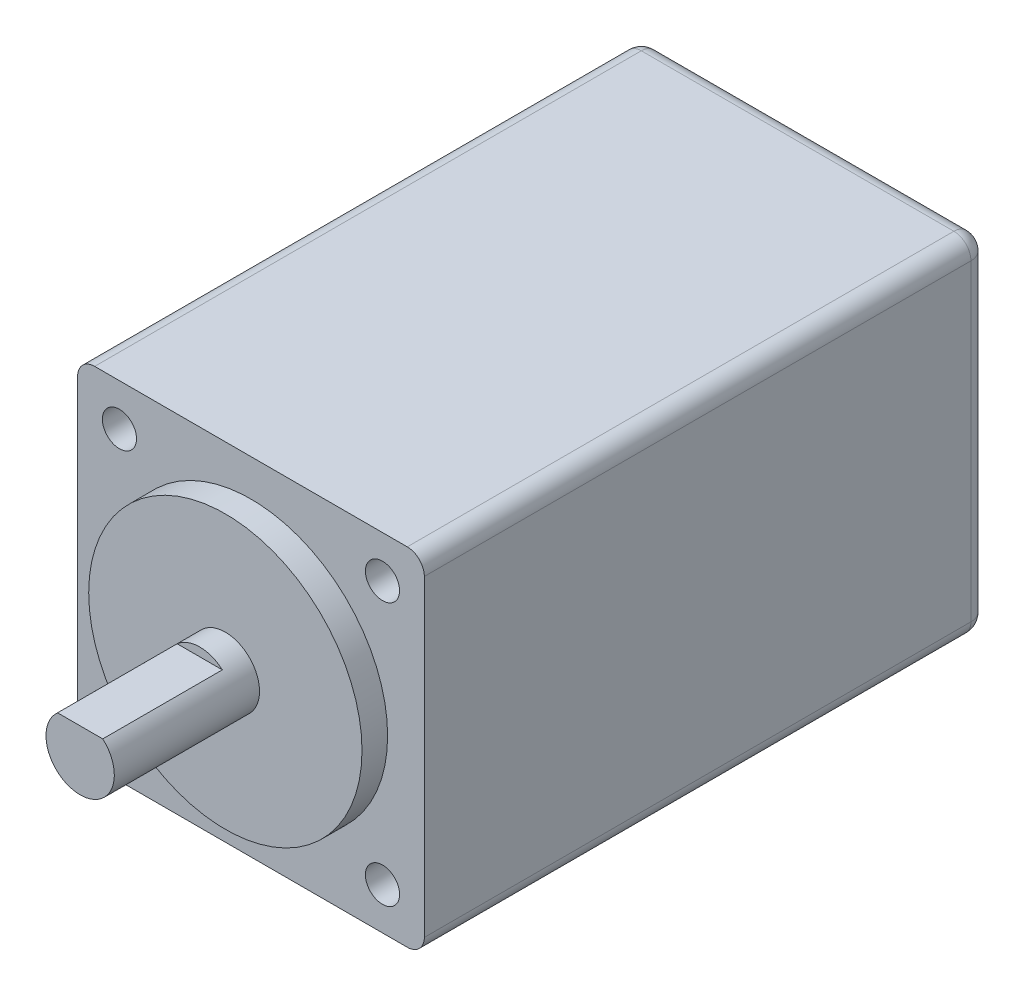
ISO-10303-21;
HEADER;
FILE_DESCRIPTION(('STEP AP214'),'2;1');
FILE_NAME('part.step','',(''),(''),'','','');
FILE_SCHEMA(('AUTOMOTIVE_DESIGN { 1 0 10303 214 1 1 1 1 }'));
ENDSEC;
DATA;
#1=APPLICATION_CONTEXT('core data for automotive mechanical design processes');
#2=APPLICATION_PROTOCOL_DEFINITION('international standard','automotive_design',2000,#1);
#3=PRODUCT_CONTEXT('',#1,'mechanical');
#4=PRODUCT('Part','Part','',(#3));
#5=PRODUCT_RELATED_PRODUCT_CATEGORY('part','',(#4));
#6=PRODUCT_DEFINITION_FORMATION('','',#4);
#7=PRODUCT_DEFINITION_CONTEXT('part definition',#1,'design');
#8=PRODUCT_DEFINITION('design','',#6,#7);
#9=PRODUCT_DEFINITION_SHAPE('','',#8);
#10=(LENGTH_UNIT() NAMED_UNIT(*) SI_UNIT(.MILLI.,.METRE.));
#11=(NAMED_UNIT(*) PLANE_ANGLE_UNIT() SI_UNIT($,.RADIAN.));
#12=(NAMED_UNIT(*) SI_UNIT($,.STERADIAN.) SOLID_ANGLE_UNIT());
#13=UNCERTAINTY_MEASURE_WITH_UNIT(LENGTH_MEASURE(1.E-05),#10,'distance_accuracy_value','');
#14=(GEOMETRIC_REPRESENTATION_CONTEXT(3) GLOBAL_UNCERTAINTY_ASSIGNED_CONTEXT((#13)) GLOBAL_UNIT_ASSIGNED_CONTEXT((#10,
#11,#12)) REPRESENTATION_CONTEXT('',''));
#15=CARTESIAN_POINT('',(0.,0.,0.));
#16=DIRECTION('',(0.,0.,1.));
#17=DIRECTION('',(1.,0.,0.));
#18=AXIS2_PLACEMENT_3D('',#15,#16,#17);
#19=CARTESIAN_POINT('',(0.,0.,34.5));
#20=DIRECTION('',(0.,0.,1.));
#21=DIRECTION('',(1.,0.,0.));
#22=AXIS2_PLACEMENT_3D('',#19,#20,#21);
#23=PLANE('',#22);
#24=CARTESIAN_POINT('',(0.,0.,34.5));
#25=DIRECTION('',(0.,0.,1.));
#26=DIRECTION('',(1.,0.,0.));
#27=AXIS2_PLACEMENT_3D('',#24,#25,#26);
#28=CIRCLE('',#27,8.);
#29=CARTESIAN_POINT('',(8.,0.,34.5));
#30=VERTEX_POINT('',#29);
#31=EDGE_CURVE('E144',#30,#30,#28,.T.);
#32=ORIENTED_EDGE('',*,*,#31,.T.);
#33=EDGE_LOOP('',(#32));
#34=FACE_BOUND('',#33,.T.);
#35=CARTESIAN_POINT('',(0.,0.,34.5));
#36=DIRECTION('',(0.,0.,1.));
#37=DIRECTION('',(1.,0.,0.));
#38=AXIS2_PLACEMENT_3D('',#35,#36,#37);
#39=CIRCLE('',#38,2.);
#40=CARTESIAN_POINT('',(2.,0.,34.5));
#41=VERTEX_POINT('',#40);
#42=EDGE_CURVE('E145',#41,#41,#39,.T.);
#43=ORIENTED_EDGE('',*,*,#42,.F.);
#44=EDGE_LOOP('',(#43));
#45=FACE_BOUND('',#44,.T.);
#46=ADVANCED_FACE('F33',(#34,#45),#23,.T.);
#47=CARTESIAN_POINT('',(10.15,10.15,33.));
#48=DIRECTION('',(0.,0.,-1.));
#49=DIRECTION('',(-1.,0.,0.));
#50=AXIS2_PLACEMENT_3D('',#47,#48,#49);
#51=PLANE('',#50);
#52=CARTESIAN_POINT('',(-7.69999999999969,-7.7,33.));
#53=DIRECTION('',(0.,0.,1.));
#54=DIRECTION('',(1.,0.,0.));
#55=AXIS2_PLACEMENT_3D('',#52,#53,#54);
#56=CIRCLE('',#55,1.);
#57=CARTESIAN_POINT('',(-6.69999999999969,-7.7,33.));
#58=VERTEX_POINT('',#57);
#59=EDGE_CURVE('E237',#58,#58,#56,.T.);
#60=ORIENTED_EDGE('',*,*,#59,.F.);
#61=EDGE_LOOP('',(#60));
#62=FACE_BOUND('',#61,.T.);
#63=CARTESIAN_POINT('',(7.70000000000031,-7.69999999999969,33.));
#64=DIRECTION('',(0.,0.,1.));
#65=DIRECTION('',(1.,0.,0.));
#66=AXIS2_PLACEMENT_3D('',#63,#64,#65);
#67=CIRCLE('',#66,1.);
#68=CARTESIAN_POINT('',(8.70000000000032,-7.69999999999969,33.));
#69=VERTEX_POINT('',#68);
#70=EDGE_CURVE('E245',#69,#69,#67,.T.);
#71=ORIENTED_EDGE('',*,*,#70,.F.);
#72=EDGE_LOOP('',(#71));
#73=FACE_BOUND('',#72,.T.);
#74=CARTESIAN_POINT('',(7.7,7.70000000000031,33.));
#75=DIRECTION('',(0.,0.,1.));
#76=DIRECTION('',(1.,0.,0.));
#77=AXIS2_PLACEMENT_3D('',#74,#75,#76);
#78=CIRCLE('',#77,1.);
#79=CARTESIAN_POINT('',(8.7,7.70000000000031,33.));
#80=VERTEX_POINT('',#79);
#81=EDGE_CURVE('E251',#80,#80,#78,.T.);
#82=ORIENTED_EDGE('',*,*,#81,.F.);
#83=EDGE_LOOP('',(#82));
#84=FACE_BOUND('',#83,.T.);
#85=CARTESIAN_POINT('',(-7.7,7.7,33.));
#86=DIRECTION('',(0.,0.,1.));
#87=DIRECTION('',(1.,0.,0.));
#88=AXIS2_PLACEMENT_3D('',#85,#86,#87);
#89=CIRCLE('',#88,1.);
#90=CARTESIAN_POINT('',(-6.7,7.7,33.));
#91=VERTEX_POINT('',#90);
#92=EDGE_CURVE('E257',#91,#91,#89,.T.);
#93=ORIENTED_EDGE('',*,*,#92,.F.);
#94=EDGE_LOOP('',(#93));
#95=FACE_BOUND('',#94,.T.);
#96=DIRECTION('',(0.,-1.,0.));
#97=VECTOR('',#96,1.);
#98=CARTESIAN_POINT('',(-10.15,-10.15,33.));
#99=LINE('',#98,#97);
#100=CARTESIAN_POINT('',(-10.15,9.15,33.));
#101=VERTEX_POINT('',#100);
#102=CARTESIAN_POINT('',(-10.15,-9.15,33.));
#103=VERTEX_POINT('',#102);
#104=EDGE_CURVE('E159',#101,#103,#99,.T.);
#105=ORIENTED_EDGE('',*,*,#104,.T.);
#106=CARTESIAN_POINT('',(-9.15,-9.15,33.));
#107=DIRECTION('',(0.,0.,-1.));
#108=DIRECTION('',(-1.,0.,0.));
#109=AXIS2_PLACEMENT_3D('',#106,#107,#108);
#110=CIRCLE('',#109,1.);
#111=CARTESIAN_POINT('',(-9.15,-10.15,33.));
#112=VERTEX_POINT('',#111);
#113=EDGE_CURVE('E11',#103,#112,#110,.F.);
#114=ORIENTED_EDGE('',*,*,#113,.T.);
#115=DIRECTION('',(1.,0.,0.));
#116=VECTOR('',#115,1.);
#117=CARTESIAN_POINT('',(-10.15,-10.15,33.));
#118=LINE('',#117,#116);
#119=CARTESIAN_POINT('',(9.15,-10.15,33.));
#120=VERTEX_POINT('',#119);
#121=EDGE_CURVE('E162',#112,#120,#118,.T.);
#122=ORIENTED_EDGE('',*,*,#121,.T.);
#123=CARTESIAN_POINT('',(9.15,-9.15,33.));
#124=DIRECTION('',(0.,0.,-1.));
#125=DIRECTION('',(-1.,0.,0.));
#126=AXIS2_PLACEMENT_3D('',#123,#124,#125);
#127=CIRCLE('',#126,1.);
#128=CARTESIAN_POINT('',(10.15,-9.15,33.));
#129=VERTEX_POINT('',#128);
#130=EDGE_CURVE('E42',#120,#129,#127,.F.);
#131=ORIENTED_EDGE('',*,*,#130,.T.);
#132=DIRECTION('',(0.,1.,0.));
#133=VECTOR('',#132,1.);
#134=CARTESIAN_POINT('',(10.15,-10.15,33.));
#135=LINE('',#134,#133);
#136=CARTESIAN_POINT('',(10.15,9.15,33.));
#137=VERTEX_POINT('',#136);
#138=EDGE_CURVE('E148',#129,#137,#135,.T.);
#139=ORIENTED_EDGE('',*,*,#138,.T.);
#140=CARTESIAN_POINT('',(9.15,9.15,33.));
#141=DIRECTION('',(0.,0.,-1.));
#142=DIRECTION('',(-1.,0.,0.));
#143=AXIS2_PLACEMENT_3D('',#140,#141,#142);
#144=CIRCLE('',#143,1.);
#145=CARTESIAN_POINT('',(9.15,10.15,33.));
#146=VERTEX_POINT('',#145);
#147=EDGE_CURVE('E200',#137,#146,#144,.F.);
#148=ORIENTED_EDGE('',*,*,#147,.T.);
#149=DIRECTION('',(-1.,0.,0.));
#150=VECTOR('',#149,1.);
#151=CARTESIAN_POINT('',(-10.15,10.15,33.));
#152=LINE('',#151,#150);
#153=CARTESIAN_POINT('',(-9.15,10.15,33.));
#154=VERTEX_POINT('',#153);
#155=EDGE_CURVE('E156',#146,#154,#152,.T.);
#156=ORIENTED_EDGE('',*,*,#155,.T.);
#157=CARTESIAN_POINT('',(-9.15,9.15,33.));
#158=DIRECTION('',(0.,0.,-1.));
#159=DIRECTION('',(-1.,0.,0.));
#160=AXIS2_PLACEMENT_3D('',#157,#158,#159);
#161=CIRCLE('',#160,1.);
#162=EDGE_CURVE('E202',#154,#101,#161,.F.);
#163=ORIENTED_EDGE('',*,*,#162,.T.);
#164=EDGE_LOOP('',(#105,#114,#122,#131,#139,#148,#156,#163));
#165=FACE_BOUND('',#164,.T.);
#166=CARTESIAN_POINT('',(0.,0.,33.));
#167=DIRECTION('',(0.,0.,-1.));
#168=DIRECTION('',(-1.,0.,0.));
#169=AXIS2_PLACEMENT_3D('',#166,#167,#168);
#170=CIRCLE('',#169,8.);
#171=CARTESIAN_POINT('',(-8.,0.,33.));
#172=VERTEX_POINT('',#171);
#173=EDGE_CURVE('E134',#172,#172,#170,.F.);
#174=ORIENTED_EDGE('',*,*,#173,.F.);
#175=EDGE_LOOP('',(#174));
#176=FACE_BOUND('',#175,.T.);
#177=ADVANCED_FACE('F278',(#62,#73,#84,#95,#165,#176),#51,.F.);
#178=CARTESIAN_POINT('',(10.15,-10.15,33.));
#179=DIRECTION('',(-1.,0.,0.));
#180=DIRECTION('',(0.,0.,1.));
#181=AXIS2_PLACEMENT_3D('',#178,#179,#180);
#182=PLANE('',#181);
#183=ORIENTED_EDGE('',*,*,#138,.F.);
#184=DIRECTION('',(0.,0.,-1.));
#185=VECTOR('',#184,1.);
#186=CARTESIAN_POINT('',(10.15,-9.15,33.));
#187=LINE('',#186,#185);
#188=CARTESIAN_POINT('',(10.15,-9.15,1.));
#189=VERTEX_POINT('',#188);
#190=EDGE_CURVE('E50',#129,#189,#187,.T.);
#191=ORIENTED_EDGE('',*,*,#190,.T.);
#192=DIRECTION('',(0.,1.,0.));
#193=VECTOR('',#192,1.);
#194=CARTESIAN_POINT('',(10.15,10.15,1.));
#195=LINE('',#194,#193);
#196=CARTESIAN_POINT('',(10.15,9.15,1.));
#197=VERTEX_POINT('',#196);
#198=EDGE_CURVE('E55',#189,#197,#195,.T.);
#199=ORIENTED_EDGE('',*,*,#198,.T.);
#200=DIRECTION('',(0.,0.,-1.));
#201=VECTOR('',#200,1.);
#202=CARTESIAN_POINT('',(10.15,9.15,33.));
#203=LINE('',#202,#201);
#204=EDGE_CURVE('E196',#197,#137,#203,.F.);
#205=ORIENTED_EDGE('',*,*,#204,.T.);
#206=EDGE_LOOP('',(#183,#191,#199,#205));
#207=FACE_BOUND('',#206,.T.);
#208=ADVANCED_FACE('F284',(#207),#182,.F.);
#209=CARTESIAN_POINT('',(-10.15,10.15,33.));
#210=DIRECTION('',(0.,-1.,0.));
#211=DIRECTION('',(0.,0.,-1.));
#212=AXIS2_PLACEMENT_3D('',#209,#210,#211);
#213=PLANE('',#212);
#214=DIRECTION('',(-1.,0.,0.));
#215=VECTOR('',#214,1.);
#216=CARTESIAN_POINT('',(-10.15,10.15,1.));
#217=LINE('',#216,#215);
#218=CARTESIAN_POINT('',(9.15,10.15,1.));
#219=VERTEX_POINT('',#218);
#220=CARTESIAN_POINT('',(-9.15,10.15,1.));
#221=VERTEX_POINT('',#220);
#222=EDGE_CURVE('E170',#219,#221,#217,.T.);
#223=ORIENTED_EDGE('',*,*,#222,.T.);
#224=DIRECTION('',(0.,0.,-1.));
#225=VECTOR('',#224,1.);
#226=CARTESIAN_POINT('',(-9.15,10.15,33.));
#227=LINE('',#226,#225);
#228=EDGE_CURVE('E173',#221,#154,#227,.F.);
#229=ORIENTED_EDGE('',*,*,#228,.T.);
#230=ORIENTED_EDGE('',*,*,#155,.F.);
#231=DIRECTION('',(0.,0.,-1.));
#232=VECTOR('',#231,1.);
#233=CARTESIAN_POINT('',(9.15,10.15,33.));
#234=LINE('',#233,#232);
#235=EDGE_CURVE('E168',#146,#219,#234,.T.);
#236=ORIENTED_EDGE('',*,*,#235,.T.);
#237=EDGE_LOOP('',(#223,#229,#230,#236));
#238=FACE_BOUND('',#237,.T.);
#239=ADVANCED_FACE('F305',(#238),#213,.F.);
#240=CARTESIAN_POINT('',(-10.15,-10.15,33.));
#241=DIRECTION('',(1.,0.,0.));
#242=DIRECTION('',(0.,0.,-1.));
#243=AXIS2_PLACEMENT_3D('',#240,#241,#242);
#244=PLANE('',#243);
#245=DIRECTION('',(0.,-1.,0.));
#246=VECTOR('',#245,1.);
#247=CARTESIAN_POINT('',(-10.15,-10.15,1.));
#248=LINE('',#247,#246);
#249=CARTESIAN_POINT('',(-10.15,9.15,1.));
#250=VERTEX_POINT('',#249);
#251=CARTESIAN_POINT('',(-10.15,-9.15,1.));
#252=VERTEX_POINT('',#251);
#253=EDGE_CURVE('E186',#250,#252,#248,.T.);
#254=ORIENTED_EDGE('',*,*,#253,.T.);
#255=DIRECTION('',(0.,0.,-1.));
#256=VECTOR('',#255,1.);
#257=CARTESIAN_POINT('',(-10.15,-9.15,33.));
#258=LINE('',#257,#256);
#259=EDGE_CURVE('E188',#252,#103,#258,.F.);
#260=ORIENTED_EDGE('',*,*,#259,.T.);
#261=ORIENTED_EDGE('',*,*,#104,.F.);
#262=DIRECTION('',(0.,0.,-1.));
#263=VECTOR('',#262,1.);
#264=CARTESIAN_POINT('',(-10.15,9.15,33.));
#265=LINE('',#264,#263);
#266=EDGE_CURVE('E184',#101,#250,#265,.T.);
#267=ORIENTED_EDGE('',*,*,#266,.T.);
#268=EDGE_LOOP('',(#254,#260,#261,#267));
#269=FACE_BOUND('',#268,.T.);
#270=ADVANCED_FACE('F301',(#269),#244,.F.);
#271=CARTESIAN_POINT('',(-10.15,-10.15,33.));
#272=DIRECTION('',(0.,1.,0.));
#273=DIRECTION('',(0.,0.,1.));
#274=AXIS2_PLACEMENT_3D('',#271,#272,#273);
#275=PLANE('',#274);
#276=ORIENTED_EDGE('',*,*,#121,.F.);
#277=DIRECTION('',(0.,0.,-1.));
#278=VECTOR('',#277,1.);
#279=CARTESIAN_POINT('',(-9.15,-10.15,33.));
#280=LINE('',#279,#278);
#281=CARTESIAN_POINT('',(-9.15,-10.15,1.));
#282=VERTEX_POINT('',#281);
#283=EDGE_CURVE('E194',#112,#282,#280,.T.);
#284=ORIENTED_EDGE('',*,*,#283,.T.);
#285=DIRECTION('',(1.,0.,0.));
#286=VECTOR('',#285,1.);
#287=CARTESIAN_POINT('',(10.15,-10.15,1.));
#288=LINE('',#287,#286);
#289=CARTESIAN_POINT('',(9.15,-10.15,1.));
#290=VERTEX_POINT('',#289);
#291=EDGE_CURVE('E192',#282,#290,#288,.T.);
#292=ORIENTED_EDGE('',*,*,#291,.T.);
#293=DIRECTION('',(0.,0.,-1.));
#294=VECTOR('',#293,1.);
#295=CARTESIAN_POINT('',(9.15,-10.15,33.));
#296=LINE('',#295,#294);
#297=EDGE_CURVE('E190',#290,#120,#296,.F.);
#298=ORIENTED_EDGE('',*,*,#297,.T.);
#299=EDGE_LOOP('',(#276,#284,#292,#298));
#300=FACE_BOUND('',#299,.T.);
#301=ADVANCED_FACE('F297',(#300),#275,.F.);
#302=CARTESIAN_POINT('',(10.15,10.15,0.));
#303=DIRECTION('',(0.,0.,-1.));
#304=DIRECTION('',(-1.,0.,0.));
#305=AXIS2_PLACEMENT_3D('',#302,#303,#304);
#306=PLANE('',#305);
#307=DIRECTION('',(0.,-1.,0.));
#308=VECTOR('',#307,1.);
#309=CARTESIAN_POINT('',(-9.15,10.15,0.));
#310=LINE('',#309,#308);
#311=CARTESIAN_POINT('',(-9.15,-9.15,0.));
#312=VERTEX_POINT('',#311);
#313=CARTESIAN_POINT('',(-9.15,9.15,0.));
#314=VERTEX_POINT('',#313);
#315=EDGE_CURVE('E179',#312,#314,#310,.F.);
#316=ORIENTED_EDGE('',*,*,#315,.T.);
#317=DIRECTION('',(-1.,0.,0.));
#318=VECTOR('',#317,1.);
#319=CARTESIAN_POINT('',(10.15,9.15,0.));
#320=LINE('',#319,#318);
#321=CARTESIAN_POINT('',(9.15,9.15,0.));
#322=VERTEX_POINT('',#321);
#323=EDGE_CURVE('E181',#314,#322,#320,.F.);
#324=ORIENTED_EDGE('',*,*,#323,.T.);
#325=DIRECTION('',(0.,1.,0.));
#326=VECTOR('',#325,1.);
#327=CARTESIAN_POINT('',(9.15,-10.15,0.));
#328=LINE('',#327,#326);
#329=CARTESIAN_POINT('',(9.15,-9.15,0.));
#330=VERTEX_POINT('',#329);
#331=EDGE_CURVE('E175',#322,#330,#328,.F.);
#332=ORIENTED_EDGE('',*,*,#331,.T.);
#333=DIRECTION('',(1.,0.,0.));
#334=VECTOR('',#333,1.);
#335=CARTESIAN_POINT('',(-10.15,-9.15,0.));
#336=LINE('',#335,#334);
#337=EDGE_CURVE('E177',#330,#312,#336,.F.);
#338=ORIENTED_EDGE('',*,*,#337,.T.);
#339=EDGE_LOOP('',(#316,#324,#332,#338));
#340=FACE_BOUND('',#339,.T.);
#341=ADVANCED_FACE('F292',(#340),#306,.T.);
#342=CARTESIAN_POINT('',(0.,0.,34.5));
#343=DIRECTION('',(0.,0.,-1.));
#344=DIRECTION('',(-1.,0.,0.));
#345=AXIS2_PLACEMENT_3D('',#342,#343,#344);
#346=CYLINDRICAL_SURFACE('',#345,8.);
#347=ORIENTED_EDGE('',*,*,#31,.F.);
#348=EDGE_LOOP('',(#347));
#349=FACE_BOUND('',#348,.T.);
#350=ORIENTED_EDGE('',*,*,#173,.T.);
#351=EDGE_LOOP('',(#350));
#352=FACE_BOUND('',#351,.T.);
#353=ADVANCED_FACE('F290',(#349,#352),#346,.T.);
#354=CARTESIAN_POINT('',(0.,0.,43.));
#355=DIRECTION('',(0.,0.,-1.));
#356=DIRECTION('',(-1.,0.,0.));
#357=AXIS2_PLACEMENT_3D('',#354,#355,#356);
#358=CYLINDRICAL_SURFACE('',#357,2.);
#359=CARTESIAN_POINT('',(0.,0.,43.));
#360=DIRECTION('',(0.,0.,1.));
#361=DIRECTION('',(1.,0.,0.));
#362=AXIS2_PLACEMENT_3D('',#359,#360,#361);
#363=CIRCLE('',#362,2.);
#364=CARTESIAN_POINT('',(-1.3228756555323,1.5,43.));
#365=VERTEX_POINT('',#364);
#366=CARTESIAN_POINT('',(1.3228756555323,1.5,43.));
#367=VERTEX_POINT('',#366);
#368=EDGE_CURVE('E140',#365,#367,#363,.T.);
#369=ORIENTED_EDGE('',*,*,#368,.F.);
#370=DIRECTION('',(0.,0.,-1.));
#371=VECTOR('',#370,1.);
#372=CARTESIAN_POINT('',(-1.3228756555323,1.5,43.));
#373=LINE('',#372,#371);
#374=CARTESIAN_POINT('',(-1.3228756555323,1.5,36.));
#375=VERTEX_POINT('',#374);
#376=EDGE_CURVE('E129',#365,#375,#373,.T.);
#377=ORIENTED_EDGE('',*,*,#376,.T.);
#378=CARTESIAN_POINT('',(0.,0.,36.));
#379=DIRECTION('',(0.,0.,-1.));
#380=DIRECTION('',(-1.,0.,0.));
#381=AXIS2_PLACEMENT_3D('',#378,#379,#380);
#382=CIRCLE('',#381,2.);
#383=CARTESIAN_POINT('',(1.3228756555323,1.5,36.));
#384=VERTEX_POINT('',#383);
#385=EDGE_CURVE('E133',#375,#384,#382,.T.);
#386=ORIENTED_EDGE('',*,*,#385,.T.);
#387=DIRECTION('',(0.,0.,-1.));
#388=VECTOR('',#387,1.);
#389=CARTESIAN_POINT('',(1.3228756555323,1.5,43.));
#390=LINE('',#389,#388);
#391=EDGE_CURVE('E126',#384,#367,#390,.F.);
#392=ORIENTED_EDGE('',*,*,#391,.T.);
#393=EDGE_LOOP('',(#369,#377,#386,#392));
#394=FACE_BOUND('',#393,.T.);
#395=ORIENTED_EDGE('',*,*,#42,.T.);
#396=EDGE_LOOP('',(#395));
#397=FACE_BOUND('',#396,.T.);
#398=ADVANCED_FACE('F138',(#394,#397),#358,.T.);
#399=CARTESIAN_POINT('',(0.,0.,43.));
#400=DIRECTION('',(0.,0.,1.));
#401=DIRECTION('',(1.,0.,0.));
#402=AXIS2_PLACEMENT_3D('',#399,#400,#401);
#403=PLANE('',#402);
#404=DIRECTION('',(1.,0.,0.));
#405=VECTOR('',#404,1.);
#406=CARTESIAN_POINT('',(0.,1.5,43.));
#407=LINE('',#406,#405);
#408=EDGE_CURVE('E122',#365,#367,#407,.T.);
#409=ORIENTED_EDGE('',*,*,#408,.F.);
#410=ORIENTED_EDGE('',*,*,#368,.T.);
#411=EDGE_LOOP('',(#409,#410));
#412=FACE_BOUND('',#411,.T.);
#413=ADVANCED_FACE('F143',(#412),#403,.T.);
#414=CARTESIAN_POINT('',(-5.,2.,36.));
#415=DIRECTION('',(0.,0.,-1.));
#416=DIRECTION('',(-1.,0.,0.));
#417=AXIS2_PLACEMENT_3D('',#414,#415,#416);
#418=PLANE('',#417);
#419=DIRECTION('',(1.,0.,0.));
#420=VECTOR('',#419,1.);
#421=CARTESIAN_POINT('',(-5.,1.5,36.));
#422=LINE('',#421,#420);
#423=EDGE_CURVE('E141',#375,#384,#422,.T.);
#424=ORIENTED_EDGE('',*,*,#423,.T.);
#425=ORIENTED_EDGE('',*,*,#385,.F.);
#426=EDGE_LOOP('',(#424,#425));
#427=FACE_BOUND('',#426,.T.);
#428=ADVANCED_FACE('F266',(#427),#418,.F.);
#429=CARTESIAN_POINT('',(-5.,1.5,43.));
#430=DIRECTION('',(0.,-1.,0.));
#431=DIRECTION('',(0.,0.,-1.));
#432=AXIS2_PLACEMENT_3D('',#429,#430,#431);
#433=PLANE('',#432);
#434=ORIENTED_EDGE('',*,*,#408,.T.);
#435=ORIENTED_EDGE('',*,*,#391,.F.);
#436=ORIENTED_EDGE('',*,*,#423,.F.);
#437=ORIENTED_EDGE('',*,*,#376,.F.);
#438=EDGE_LOOP('',(#434,#435,#436,#437));
#439=FACE_BOUND('',#438,.T.);
#440=ADVANCED_FACE('F124',(#439),#433,.F.);
#441=CARTESIAN_POINT('',(-7.7,7.7,30.5));
#442=DIRECTION('',(0.,0.,1.));
#443=DIRECTION('',(1.,0.,0.));
#444=AXIS2_PLACEMENT_3D('',#441,#442,#443);
#445=CYLINDRICAL_SURFACE('',#444,1.);
#446=CARTESIAN_POINT('',(-7.7,7.7,30.5));
#447=DIRECTION('',(0.,0.,1.));
#448=DIRECTION('',(1.,0.,0.));
#449=AXIS2_PLACEMENT_3D('',#446,#447,#448);
#450=CIRCLE('',#449,1.);
#451=CARTESIAN_POINT('',(-6.7,7.7,30.5));
#452=VERTEX_POINT('',#451);
#453=EDGE_CURVE('E260',#452,#452,#450,.T.);
#454=ORIENTED_EDGE('',*,*,#453,.F.);
#455=EDGE_LOOP('',(#454));
#456=FACE_BOUND('',#455,.T.);
#457=ORIENTED_EDGE('',*,*,#92,.T.);
#458=EDGE_LOOP('',(#457));
#459=FACE_BOUND('',#458,.T.);
#460=ADVANCED_FACE('F273',(#456,#459),#445,.F.);
#461=CARTESIAN_POINT('',(-7.7,7.7,30.5));
#462=DIRECTION('',(0.,0.,1.));
#463=DIRECTION('',(1.,0.,0.));
#464=AXIS2_PLACEMENT_3D('',#461,#462,#463);
#465=PLANE('',#464);
#466=ORIENTED_EDGE('',*,*,#453,.T.);
#467=EDGE_LOOP('',(#466));
#468=FACE_BOUND('',#467,.T.);
#469=ADVANCED_FACE('F418',(#468),#465,.T.);
#470=CARTESIAN_POINT('',(7.7,7.70000000000031,30.5));
#471=DIRECTION('',(0.,0.,1.));
#472=DIRECTION('',(1.,0.,0.));
#473=AXIS2_PLACEMENT_3D('',#470,#471,#472);
#474=CYLINDRICAL_SURFACE('',#473,1.);
#475=CARTESIAN_POINT('',(7.7,7.70000000000031,30.5));
#476=DIRECTION('',(0.,0.,1.));
#477=DIRECTION('',(1.,0.,0.));
#478=AXIS2_PLACEMENT_3D('',#475,#476,#477);
#479=CIRCLE('',#478,1.);
#480=CARTESIAN_POINT('',(8.7,7.70000000000031,30.5));
#481=VERTEX_POINT('',#480);
#482=EDGE_CURVE('E254',#481,#481,#479,.T.);
#483=ORIENTED_EDGE('',*,*,#482,.F.);
#484=EDGE_LOOP('',(#483));
#485=FACE_BOUND('',#484,.T.);
#486=ORIENTED_EDGE('',*,*,#81,.T.);
#487=EDGE_LOOP('',(#486));
#488=FACE_BOUND('',#487,.T.);
#489=ADVANCED_FACE('F414',(#485,#488),#474,.F.);
#490=CARTESIAN_POINT('',(7.7,7.70000000000031,30.5));
#491=DIRECTION('',(0.,0.,1.));
#492=DIRECTION('',(1.,0.,0.));
#493=AXIS2_PLACEMENT_3D('',#490,#491,#492);
#494=PLANE('',#493);
#495=ORIENTED_EDGE('',*,*,#482,.T.);
#496=EDGE_LOOP('',(#495));
#497=FACE_BOUND('',#496,.T.);
#498=ADVANCED_FACE('F410',(#497),#494,.T.);
#499=CARTESIAN_POINT('',(7.70000000000031,-7.69999999999969,30.5));
#500=DIRECTION('',(0.,0.,1.));
#501=DIRECTION('',(1.,0.,0.));
#502=AXIS2_PLACEMENT_3D('',#499,#500,#501);
#503=CYLINDRICAL_SURFACE('',#502,1.);
#504=CARTESIAN_POINT('',(7.70000000000031,-7.69999999999969,30.5));
#505=DIRECTION('',(0.,0.,1.));
#506=DIRECTION('',(1.,0.,0.));
#507=AXIS2_PLACEMENT_3D('',#504,#505,#506);
#508=CIRCLE('',#507,1.);
#509=CARTESIAN_POINT('',(8.70000000000032,-7.69999999999969,30.5));
#510=VERTEX_POINT('',#509);
#511=EDGE_CURVE('E248',#510,#510,#508,.T.);
#512=ORIENTED_EDGE('',*,*,#511,.F.);
#513=EDGE_LOOP('',(#512));
#514=FACE_BOUND('',#513,.T.);
#515=ORIENTED_EDGE('',*,*,#70,.T.);
#516=EDGE_LOOP('',(#515));
#517=FACE_BOUND('',#516,.T.);
#518=ADVANCED_FACE('F406',(#514,#517),#503,.F.);
#519=CARTESIAN_POINT('',(7.70000000000031,-7.69999999999969,30.5));
#520=DIRECTION('',(0.,0.,1.));
#521=DIRECTION('',(1.,0.,0.));
#522=AXIS2_PLACEMENT_3D('',#519,#520,#521);
#523=PLANE('',#522);
#524=ORIENTED_EDGE('',*,*,#511,.T.);
#525=EDGE_LOOP('',(#524));
#526=FACE_BOUND('',#525,.T.);
#527=ADVANCED_FACE('F400',(#526),#523,.T.);
#528=CARTESIAN_POINT('',(-7.69999999999969,-7.7,30.5));
#529=DIRECTION('',(0.,0.,1.));
#530=DIRECTION('',(1.,0.,0.));
#531=AXIS2_PLACEMENT_3D('',#528,#529,#530);
#532=CYLINDRICAL_SURFACE('',#531,1.);
#533=CARTESIAN_POINT('',(-7.69999999999969,-7.7,30.5));
#534=DIRECTION('',(0.,0.,1.));
#535=DIRECTION('',(1.,0.,0.));
#536=AXIS2_PLACEMENT_3D('',#533,#534,#535);
#537=CIRCLE('',#536,1.);
#538=CARTESIAN_POINT('',(-6.69999999999969,-7.7,30.5));
#539=VERTEX_POINT('',#538);
#540=EDGE_CURVE('E240',#539,#539,#537,.T.);
#541=ORIENTED_EDGE('',*,*,#540,.F.);
#542=EDGE_LOOP('',(#541));
#543=FACE_BOUND('',#542,.T.);
#544=ORIENTED_EDGE('',*,*,#59,.T.);
#545=EDGE_LOOP('',(#544));
#546=FACE_BOUND('',#545,.T.);
#547=ADVANCED_FACE('F394',(#543,#546),#532,.F.);
#548=CARTESIAN_POINT('',(-7.69999999999969,-7.7,30.5));
#549=DIRECTION('',(0.,0.,1.));
#550=DIRECTION('',(1.,0.,0.));
#551=AXIS2_PLACEMENT_3D('',#548,#549,#550);
#552=PLANE('',#551);
#553=ORIENTED_EDGE('',*,*,#540,.T.);
#554=EDGE_LOOP('',(#553));
#555=FACE_BOUND('',#554,.T.);
#556=ADVANCED_FACE('F356',(#555),#552,.T.);
#557=CARTESIAN_POINT('',(9.15,-9.15,33.));
#558=DIRECTION('',(0.,0.,-1.));
#559=DIRECTION('',(-1.,0.,0.));
#560=AXIS2_PLACEMENT_3D('',#557,#558,#559);
#561=CYLINDRICAL_SURFACE('',#560,1.);
#562=ORIENTED_EDGE('',*,*,#130,.F.);
#563=ORIENTED_EDGE('',*,*,#297,.F.);
#564=CARTESIAN_POINT('',(9.15,-9.15,1.));
#565=DIRECTION('',(0.,0.,-1.));
#566=DIRECTION('',(-1.,0.,0.));
#567=AXIS2_PLACEMENT_3D('',#564,#565,#566);
#568=CIRCLE('',#567,1.);
#569=EDGE_CURVE('E232',#189,#290,#568,.T.);
#570=ORIENTED_EDGE('',*,*,#569,.F.);
#571=ORIENTED_EDGE('',*,*,#190,.F.);
#572=EDGE_LOOP('',(#562,#563,#570,#571));
#573=FACE_BOUND('',#572,.T.);
#574=ADVANCED_FACE('F35',(#573),#561,.T.);
#575=CARTESIAN_POINT('',(-9.15,-9.15,33.));
#576=DIRECTION('',(0.,0.,-1.));
#577=DIRECTION('',(-1.,0.,0.));
#578=AXIS2_PLACEMENT_3D('',#575,#576,#577);
#579=CYLINDRICAL_SURFACE('',#578,1.);
#580=ORIENTED_EDGE('',*,*,#113,.F.);
#581=ORIENTED_EDGE('',*,*,#259,.F.);
#582=CARTESIAN_POINT('',(-9.15,-9.15,1.));
#583=DIRECTION('',(0.,0.,-1.));
#584=DIRECTION('',(-1.,0.,0.));
#585=AXIS2_PLACEMENT_3D('',#582,#583,#584);
#586=CIRCLE('',#585,1.);
#587=EDGE_CURVE('E230',#282,#252,#586,.T.);
#588=ORIENTED_EDGE('',*,*,#587,.F.);
#589=ORIENTED_EDGE('',*,*,#283,.F.);
#590=EDGE_LOOP('',(#580,#581,#588,#589));
#591=FACE_BOUND('',#590,.T.);
#592=ADVANCED_FACE('F349',(#591),#579,.T.);
#593=CARTESIAN_POINT('',(-10.15,-9.15,1.));
#594=DIRECTION('',(-1.,0.,0.));
#595=DIRECTION('',(0.,0.,1.));
#596=AXIS2_PLACEMENT_3D('',#593,#594,#595);
#597=CYLINDRICAL_SURFACE('',#596,1.);
#598=CARTESIAN_POINT('',(9.15,-9.15,1.));
#599=DIRECTION('',(1.,0.,0.));
#600=DIRECTION('',(0.,0.,-1.));
#601=AXIS2_PLACEMENT_3D('',#598,#599,#600);
#602=CIRCLE('',#601,1.);
#603=EDGE_CURVE('E37',#290,#330,#602,.T.);
#604=ORIENTED_EDGE('',*,*,#603,.F.);
#605=ORIENTED_EDGE('',*,*,#291,.F.);
#606=CARTESIAN_POINT('',(-9.15,-9.15,1.));
#607=DIRECTION('',(-1.,0.,0.));
#608=DIRECTION('',(0.,0.,1.));
#609=AXIS2_PLACEMENT_3D('',#606,#607,#608);
#610=CIRCLE('',#609,1.);
#611=EDGE_CURVE('E227',#312,#282,#610,.T.);
#612=ORIENTED_EDGE('',*,*,#611,.F.);
#613=ORIENTED_EDGE('',*,*,#337,.F.);
#614=EDGE_LOOP('',(#604,#605,#612,#613));
#615=FACE_BOUND('',#614,.T.);
#616=ADVANCED_FACE('F347',(#615),#597,.T.);
#617=CARTESIAN_POINT('',(9.15,-9.15,1.));
#618=DIRECTION('',(0.,0.,1.));
#619=DIRECTION('',(1.,0.,0.));
#620=AXIS2_PLACEMENT_3D('',#617,#618,#619);
#621=SPHERICAL_SURFACE('',#620,1.);
#622=ORIENTED_EDGE('',*,*,#569,.T.);
#623=ORIENTED_EDGE('',*,*,#603,.T.);
#624=CARTESIAN_POINT('',(9.15,-9.15,1.));
#625=DIRECTION('',(0.,-1.,0.));
#626=DIRECTION('',(0.,0.,-1.));
#627=AXIS2_PLACEMENT_3D('',#624,#625,#626);
#628=CIRCLE('',#627,1.);
#629=EDGE_CURVE('E224',#189,#330,#628,.F.);
#630=ORIENTED_EDGE('',*,*,#629,.F.);
#631=EDGE_LOOP('',(#622,#623,#630));
#632=FACE_BOUND('',#631,.T.);
#633=ADVANCED_FACE('F343',(#632),#621,.T.);
#634=CARTESIAN_POINT('',(-9.15,-9.15,1.));
#635=DIRECTION('',(0.,0.,1.));
#636=DIRECTION('',(1.,0.,0.));
#637=AXIS2_PLACEMENT_3D('',#634,#635,#636);
#638=SPHERICAL_SURFACE('',#637,1.);
#639=ORIENTED_EDGE('',*,*,#611,.T.);
#640=ORIENTED_EDGE('',*,*,#587,.T.);
#641=CARTESIAN_POINT('',(-9.15,-9.15,1.));
#642=DIRECTION('',(0.,-1.,0.));
#643=DIRECTION('',(0.,0.,-1.));
#644=AXIS2_PLACEMENT_3D('',#641,#642,#643);
#645=CIRCLE('',#644,1.);
#646=EDGE_CURVE('E221',#312,#252,#645,.F.);
#647=ORIENTED_EDGE('',*,*,#646,.F.);
#648=EDGE_LOOP('',(#639,#640,#647));
#649=FACE_BOUND('',#648,.T.);
#650=ADVANCED_FACE('F339',(#649),#638,.T.);
#651=CARTESIAN_POINT('',(9.15,-10.15,1.));
#652=DIRECTION('',(0.,-1.,0.));
#653=DIRECTION('',(0.,0.,-1.));
#654=AXIS2_PLACEMENT_3D('',#651,#652,#653);
#655=CYLINDRICAL_SURFACE('',#654,1.);
#656=ORIENTED_EDGE('',*,*,#629,.T.);
#657=ORIENTED_EDGE('',*,*,#331,.F.);
#658=CARTESIAN_POINT('',(9.15,9.15,1.));
#659=DIRECTION('',(0.,1.,0.));
#660=DIRECTION('',(0.,0.,1.));
#661=AXIS2_PLACEMENT_3D('',#658,#659,#660);
#662=CIRCLE('',#661,1.);
#663=EDGE_CURVE('E218',#197,#322,#662,.T.);
#664=ORIENTED_EDGE('',*,*,#663,.F.);
#665=ORIENTED_EDGE('',*,*,#198,.F.);
#666=EDGE_LOOP('',(#656,#657,#664,#665));
#667=FACE_BOUND('',#666,.T.);
#668=ADVANCED_FACE('F335',(#667),#655,.T.);
#669=CARTESIAN_POINT('',(9.15,9.15,33.));
#670=DIRECTION('',(0.,0.,-1.));
#671=DIRECTION('',(-1.,0.,0.));
#672=AXIS2_PLACEMENT_3D('',#669,#670,#671);
#673=CYLINDRICAL_SURFACE('',#672,1.);
#674=ORIENTED_EDGE('',*,*,#147,.F.);
#675=ORIENTED_EDGE('',*,*,#204,.F.);
#676=CARTESIAN_POINT('',(9.15,9.15,1.));
#677=DIRECTION('',(0.,0.,-1.));
#678=DIRECTION('',(-1.,0.,0.));
#679=AXIS2_PLACEMENT_3D('',#676,#677,#678);
#680=CIRCLE('',#679,1.);
#681=EDGE_CURVE('E215',#219,#197,#680,.T.);
#682=ORIENTED_EDGE('',*,*,#681,.F.);
#683=ORIENTED_EDGE('',*,*,#235,.F.);
#684=EDGE_LOOP('',(#674,#675,#682,#683));
#685=FACE_BOUND('',#684,.T.);
#686=ADVANCED_FACE('F331',(#685),#673,.T.);
#687=CARTESIAN_POINT('',(-9.15,9.15,33.));
#688=DIRECTION('',(0.,0.,-1.));
#689=DIRECTION('',(-1.,0.,0.));
#690=AXIS2_PLACEMENT_3D('',#687,#688,#689);
#691=CYLINDRICAL_SURFACE('',#690,1.);
#692=ORIENTED_EDGE('',*,*,#162,.F.);
#693=ORIENTED_EDGE('',*,*,#228,.F.);
#694=CARTESIAN_POINT('',(-9.15,9.15,1.));
#695=DIRECTION('',(0.,0.,-1.));
#696=DIRECTION('',(-1.,0.,0.));
#697=AXIS2_PLACEMENT_3D('',#694,#695,#696);
#698=CIRCLE('',#697,1.);
#699=EDGE_CURVE('E212',#250,#221,#698,.T.);
#700=ORIENTED_EDGE('',*,*,#699,.F.);
#701=ORIENTED_EDGE('',*,*,#266,.F.);
#702=EDGE_LOOP('',(#692,#693,#700,#701));
#703=FACE_BOUND('',#702,.T.);
#704=ADVANCED_FACE('F327',(#703),#691,.T.);
#705=CARTESIAN_POINT('',(-9.15,-10.15,1.));
#706=DIRECTION('',(0.,1.,0.));
#707=DIRECTION('',(0.,0.,1.));
#708=AXIS2_PLACEMENT_3D('',#705,#706,#707);
#709=CYLINDRICAL_SURFACE('',#708,1.);
#710=ORIENTED_EDGE('',*,*,#646,.T.);
#711=ORIENTED_EDGE('',*,*,#253,.F.);
#712=CARTESIAN_POINT('',(-9.15,9.15,1.));
#713=DIRECTION('',(0.,1.,0.));
#714=DIRECTION('',(0.,0.,1.));
#715=AXIS2_PLACEMENT_3D('',#712,#713,#714);
#716=CIRCLE('',#715,1.);
#717=EDGE_CURVE('E209',#314,#250,#716,.T.);
#718=ORIENTED_EDGE('',*,*,#717,.F.);
#719=ORIENTED_EDGE('',*,*,#315,.F.);
#720=EDGE_LOOP('',(#710,#711,#718,#719));
#721=FACE_BOUND('',#720,.T.);
#722=ADVANCED_FACE('F323',(#721),#709,.T.);
#723=CARTESIAN_POINT('',(9.15,9.15,1.));
#724=DIRECTION('',(0.,0.,1.));
#725=DIRECTION('',(1.,0.,0.));
#726=AXIS2_PLACEMENT_3D('',#723,#724,#725);
#727=SPHERICAL_SURFACE('',#726,1.);
#728=ORIENTED_EDGE('',*,*,#681,.T.);
#729=ORIENTED_EDGE('',*,*,#663,.T.);
#730=CARTESIAN_POINT('',(9.15,9.15,1.));
#731=DIRECTION('',(1.,0.,0.));
#732=DIRECTION('',(0.,0.,-1.));
#733=AXIS2_PLACEMENT_3D('',#730,#731,#732);
#734=CIRCLE('',#733,1.);
#735=EDGE_CURVE('E207',#219,#322,#734,.F.);
#736=ORIENTED_EDGE('',*,*,#735,.F.);
#737=EDGE_LOOP('',(#728,#729,#736));
#738=FACE_BOUND('',#737,.T.);
#739=ADVANCED_FACE('F319',(#738),#727,.T.);
#740=CARTESIAN_POINT('',(-9.15,9.15,1.));
#741=DIRECTION('',(0.,0.,1.));
#742=DIRECTION('',(1.,0.,0.));
#743=AXIS2_PLACEMENT_3D('',#740,#741,#742);
#744=SPHERICAL_SURFACE('',#743,1.);
#745=ORIENTED_EDGE('',*,*,#717,.T.);
#746=ORIENTED_EDGE('',*,*,#699,.T.);
#747=CARTESIAN_POINT('',(-9.15,9.15,1.));
#748=DIRECTION('',(-1.,0.,0.));
#749=DIRECTION('',(0.,0.,1.));
#750=AXIS2_PLACEMENT_3D('',#747,#748,#749);
#751=CIRCLE('',#750,1.);
#752=EDGE_CURVE('E205',#314,#221,#751,.F.);
#753=ORIENTED_EDGE('',*,*,#752,.F.);
#754=EDGE_LOOP('',(#745,#746,#753));
#755=FACE_BOUND('',#754,.T.);
#756=ADVANCED_FACE('F315',(#755),#744,.T.);
#757=CARTESIAN_POINT('',(-10.15,9.15,1.));
#758=DIRECTION('',(1.,0.,0.));
#759=DIRECTION('',(0.,0.,-1.));
#760=AXIS2_PLACEMENT_3D('',#757,#758,#759);
#761=CYLINDRICAL_SURFACE('',#760,1.);
#762=ORIENTED_EDGE('',*,*,#735,.T.);
#763=ORIENTED_EDGE('',*,*,#323,.F.);
#764=ORIENTED_EDGE('',*,*,#752,.T.);
#765=ORIENTED_EDGE('',*,*,#222,.F.);
#766=EDGE_LOOP('',(#762,#763,#764,#765));
#767=FACE_BOUND('',#766,.T.);
#768=ADVANCED_FACE('F312',(#767),#761,.T.);
#769=CLOSED_SHELL('',(#46,#177,#208,#239,#270,#301,#341,#353,#398,#413,#428,#440,#460,#469,#489,
#498,#518,#527,#547,#556,#574,#592,#616,#633,#650,#668,#686,#704,#722,#739,#756,#768));
#770=MANIFOLD_SOLID_BREP('B2',#769);
#771=ADVANCED_BREP_SHAPE_REPRESENTATION('',(#18,#770),#14);
#772=SHAPE_DEFINITION_REPRESENTATION(#9,#771);
ENDSEC;
END-ISO-10303-21;
